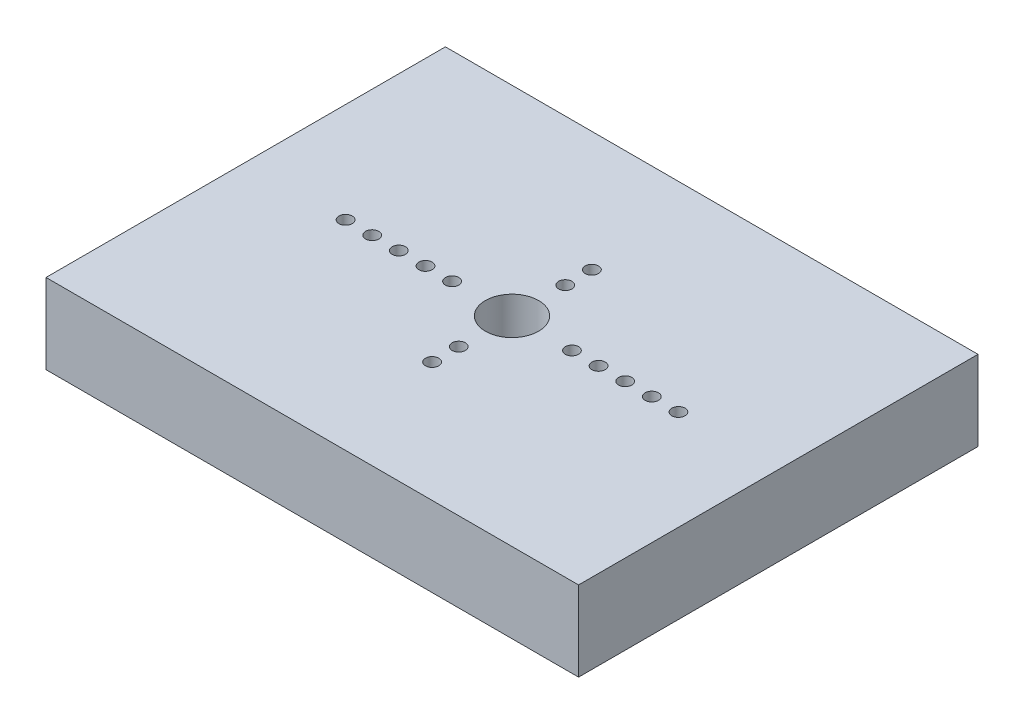
ISO-10303-21;
HEADER;
FILE_DESCRIPTION(('STEP AP214'),'2;1');
FILE_NAME('part.step','',(''),(''),'','','');
FILE_SCHEMA(('AUTOMOTIVE_DESIGN { 1 0 10303 214 1 1 1 1 }'));
ENDSEC;
DATA;
#1=APPLICATION_CONTEXT('core data for automotive mechanical design processes');
#2=APPLICATION_PROTOCOL_DEFINITION('international standard','automotive_design',2000,#1);
#3=PRODUCT_CONTEXT('',#1,'mechanical');
#4=PRODUCT('Part','Part','',(#3));
#5=PRODUCT_RELATED_PRODUCT_CATEGORY('part','',(#4));
#6=PRODUCT_DEFINITION_FORMATION('','',#4);
#7=PRODUCT_DEFINITION_CONTEXT('part definition',#1,'design');
#8=PRODUCT_DEFINITION('design','',#6,#7);
#9=PRODUCT_DEFINITION_SHAPE('','',#8);
#10=(LENGTH_UNIT() NAMED_UNIT(*) SI_UNIT(.MILLI.,.METRE.));
#11=(NAMED_UNIT(*) PLANE_ANGLE_UNIT() SI_UNIT($,.RADIAN.));
#12=(NAMED_UNIT(*) SI_UNIT($,.STERADIAN.) SOLID_ANGLE_UNIT());
#13=UNCERTAINTY_MEASURE_WITH_UNIT(LENGTH_MEASURE(1.E-05),#10,'distance_accuracy_value','');
#14=(GEOMETRIC_REPRESENTATION_CONTEXT(3) GLOBAL_UNCERTAINTY_ASSIGNED_CONTEXT((#13)) GLOBAL_UNIT_ASSIGNED_CONTEXT((#10,
#11,#12)) REPRESENTATION_CONTEXT('',''));
#15=CARTESIAN_POINT('',(0.,0.,0.));
#16=DIRECTION('',(0.,0.,1.));
#17=DIRECTION('',(1.,0.,0.));
#18=AXIS2_PLACEMENT_3D('',#15,#16,#17);
#19=CARTESIAN_POINT('',(0.,0.,0.));
#20=DIRECTION('',(0.,1.,0.));
#21=DIRECTION('',(0.,0.,1.));
#22=AXIS2_PLACEMENT_3D('',#19,#20,#21);
#23=PLANE('',#22);
#24=DIRECTION('',(0.,0.,1.));
#25=VECTOR('',#24,1.);
#26=CARTESIAN_POINT('',(-20.,0.,15.));
#27=LINE('',#26,#25);
#28=CARTESIAN_POINT('',(-20.,0.,-15.));
#29=VERTEX_POINT('',#28);
#30=CARTESIAN_POINT('',(-20.,0.,15.));
#31=VERTEX_POINT('',#30);
#32=EDGE_CURVE('E321',#29,#31,#27,.T.);
#33=ORIENTED_EDGE('',*,*,#32,.F.);
#34=DIRECTION('',(-1.,0.,0.));
#35=VECTOR('',#34,1.);
#36=CARTESIAN_POINT('',(20.,0.,-15.));
#37=LINE('',#36,#35);
#38=CARTESIAN_POINT('',(20.,0.,-15.));
#39=VERTEX_POINT('',#38);
#40=EDGE_CURVE('E63',#39,#29,#37,.T.);
#41=ORIENTED_EDGE('',*,*,#40,.F.);
#42=DIRECTION('',(0.,0.,-1.));
#43=VECTOR('',#42,1.);
#44=CARTESIAN_POINT('',(20.,0.,15.));
#45=LINE('',#44,#43);
#46=CARTESIAN_POINT('',(20.,0.,15.));
#47=VERTEX_POINT('',#46);
#48=EDGE_CURVE('E327',#47,#39,#45,.T.);
#49=ORIENTED_EDGE('',*,*,#48,.F.);
#50=DIRECTION('',(1.,0.,0.));
#51=VECTOR('',#50,1.);
#52=CARTESIAN_POINT('',(20.,0.,15.));
#53=LINE('',#52,#51);
#54=EDGE_CURVE('E324',#31,#47,#53,.T.);
#55=ORIENTED_EDGE('',*,*,#54,.F.);
#56=EDGE_LOOP('',(#33,#41,#49,#55));
#57=FACE_BOUND('',#56,.T.);
#58=DIRECTION('',(0.,0.,-1.));
#59=VECTOR('',#58,1.);
#60=CARTESIAN_POINT('',(2.55,0.,2.55));
#61=LINE('',#60,#59);
#62=CARTESIAN_POINT('',(2.55,0.,7.85));
#63=VERTEX_POINT('',#62);
#64=CARTESIAN_POINT('',(2.55,0.,2.55));
#65=VERTEX_POINT('',#64);
#66=EDGE_CURVE('E55',#63,#65,#61,.T.);
#67=ORIENTED_EDGE('',*,*,#66,.T.);
#68=DIRECTION('',(1.,0.,0.));
#69=VECTOR('',#68,1.);
#70=CARTESIAN_POINT('',(2.55,0.,2.55));
#71=LINE('',#70,#69);
#72=CARTESIAN_POINT('',(14.5,0.,2.55));
#73=VERTEX_POINT('',#72);
#74=EDGE_CURVE('E243',#65,#73,#71,.T.);
#75=ORIENTED_EDGE('',*,*,#74,.T.);
#76=DIRECTION('',(0.,0.,-1.));
#77=VECTOR('',#76,1.);
#78=CARTESIAN_POINT('',(14.5,0.,2.55));
#79=LINE('',#78,#77);
#80=CARTESIAN_POINT('',(14.5,0.,-2.55));
#81=VERTEX_POINT('',#80);
#82=EDGE_CURVE('E247',#73,#81,#79,.T.);
#83=ORIENTED_EDGE('',*,*,#82,.T.);
#84=DIRECTION('',(-1.,0.,0.));
#85=VECTOR('',#84,1.);
#86=CARTESIAN_POINT('',(2.55,0.,-2.55));
#87=LINE('',#86,#85);
#88=CARTESIAN_POINT('',(2.55,0.,-2.55));
#89=VERTEX_POINT('',#88);
#90=EDGE_CURVE('E251',#81,#89,#87,.T.);
#91=ORIENTED_EDGE('',*,*,#90,.T.);
#92=DIRECTION('',(0.,0.,-1.));
#93=VECTOR('',#92,1.);
#94=CARTESIAN_POINT('',(2.55,0.,-7.85));
#95=LINE('',#94,#93);
#96=CARTESIAN_POINT('',(2.55,0.,-7.85));
#97=VERTEX_POINT('',#96);
#98=EDGE_CURVE('E255',#89,#97,#95,.T.);
#99=ORIENTED_EDGE('',*,*,#98,.T.);
#100=DIRECTION('',(-1.,0.,0.));
#101=VECTOR('',#100,1.);
#102=CARTESIAN_POINT('',(-2.55,0.,-7.85));
#103=LINE('',#102,#101);
#104=CARTESIAN_POINT('',(-2.55,0.,-7.85));
#105=VERTEX_POINT('',#104);
#106=EDGE_CURVE('E259',#97,#105,#103,.T.);
#107=ORIENTED_EDGE('',*,*,#106,.T.);
#108=DIRECTION('',(0.,0.,1.));
#109=VECTOR('',#108,1.);
#110=CARTESIAN_POINT('',(-2.55,0.,-7.85));
#111=LINE('',#110,#109);
#112=CARTESIAN_POINT('',(-2.55,0.,-2.55));
#113=VERTEX_POINT('',#112);
#114=EDGE_CURVE('E263',#105,#113,#111,.T.);
#115=ORIENTED_EDGE('',*,*,#114,.T.);
#116=DIRECTION('',(-1.,0.,0.));
#117=VECTOR('',#116,1.);
#118=CARTESIAN_POINT('',(-14.5,0.,-2.55));
#119=LINE('',#118,#117);
#120=CARTESIAN_POINT('',(-14.5,0.,-2.55));
#121=VERTEX_POINT('',#120);
#122=EDGE_CURVE('E267',#113,#121,#119,.T.);
#123=ORIENTED_EDGE('',*,*,#122,.T.);
#124=DIRECTION('',(0.,0.,1.));
#125=VECTOR('',#124,1.);
#126=CARTESIAN_POINT('',(-14.5,0.,2.55));
#127=LINE('',#126,#125);
#128=CARTESIAN_POINT('',(-14.5,0.,2.55));
#129=VERTEX_POINT('',#128);
#130=EDGE_CURVE('E271',#121,#129,#127,.T.);
#131=ORIENTED_EDGE('',*,*,#130,.T.);
#132=DIRECTION('',(1.,0.,0.));
#133=VECTOR('',#132,1.);
#134=CARTESIAN_POINT('',(-14.5,0.,2.55));
#135=LINE('',#134,#133);
#136=CARTESIAN_POINT('',(-2.55,0.,2.55));
#137=VERTEX_POINT('',#136);
#138=EDGE_CURVE('E275',#129,#137,#135,.T.);
#139=ORIENTED_EDGE('',*,*,#138,.T.);
#140=DIRECTION('',(0.,0.,1.));
#141=VECTOR('',#140,1.);
#142=CARTESIAN_POINT('',(-2.55,0.,2.55));
#143=LINE('',#142,#141);
#144=CARTESIAN_POINT('',(-2.55,0.,7.85));
#145=VERTEX_POINT('',#144);
#146=EDGE_CURVE('E279',#137,#145,#143,.T.);
#147=ORIENTED_EDGE('',*,*,#146,.T.);
#148=DIRECTION('',(1.,0.,0.));
#149=VECTOR('',#148,1.);
#150=CARTESIAN_POINT('',(-2.55,0.,7.85));
#151=LINE('',#150,#149);
#152=EDGE_CURVE('E196',#145,#63,#151,.T.);
#153=ORIENTED_EDGE('',*,*,#152,.T.);
#154=EDGE_LOOP('',(#67,#75,#83,#91,#99,#107,#115,#123,#131,#139,#147,#153));
#155=FACE_BOUND('',#154,.T.);
#156=ADVANCED_FACE('F39',(#57,#155),#23,.F.);
#157=CARTESIAN_POINT('',(-20.,3.,15.));
#158=DIRECTION('',(1.,0.,0.));
#159=DIRECTION('',(0.,0.,-1.));
#160=AXIS2_PLACEMENT_3D('',#157,#158,#159);
#161=PLANE('',#160);
#162=ORIENTED_EDGE('',*,*,#32,.T.);
#163=DIRECTION('',(0.,-1.,0.));
#164=VECTOR('',#163,1.);
#165=CARTESIAN_POINT('',(-20.,3.,15.));
#166=LINE('',#165,#164);
#167=CARTESIAN_POINT('',(-20.,6.,15.));
#168=VERTEX_POINT('',#167);
#169=EDGE_CURVE('E11',#168,#31,#166,.T.);
#170=ORIENTED_EDGE('',*,*,#169,.F.);
#171=DIRECTION('',(0.,0.,1.));
#172=VECTOR('',#171,1.);
#173=CARTESIAN_POINT('',(-20.,6.,-15.));
#174=LINE('',#173,#172);
#175=CARTESIAN_POINT('',(-20.,6.,-15.));
#176=VERTEX_POINT('',#175);
#177=EDGE_CURVE('E166',#176,#168,#174,.T.);
#178=ORIENTED_EDGE('',*,*,#177,.F.);
#179=DIRECTION('',(0.,-1.,0.));
#180=VECTOR('',#179,1.);
#181=CARTESIAN_POINT('',(-20.,3.,-15.));
#182=LINE('',#181,#180);
#183=EDGE_CURVE('E154',#176,#29,#182,.T.);
#184=ORIENTED_EDGE('',*,*,#183,.T.);
#185=EDGE_LOOP('',(#162,#170,#178,#184));
#186=FACE_BOUND('',#185,.T.);
#187=ADVANCED_FACE('F41',(#186),#161,.F.);
#188=CARTESIAN_POINT('',(20.,3.,15.));
#189=DIRECTION('',(0.,0.,-1.));
#190=DIRECTION('',(-1.,0.,0.));
#191=AXIS2_PLACEMENT_3D('',#188,#189,#190);
#192=PLANE('',#191);
#193=ORIENTED_EDGE('',*,*,#54,.T.);
#194=DIRECTION('',(0.,-1.,0.));
#195=VECTOR('',#194,1.);
#196=CARTESIAN_POINT('',(20.,3.,15.));
#197=LINE('',#196,#195);
#198=CARTESIAN_POINT('',(20.,6.,15.));
#199=VERTEX_POINT('',#198);
#200=EDGE_CURVE('E48',#199,#47,#197,.T.);
#201=ORIENTED_EDGE('',*,*,#200,.F.);
#202=DIRECTION('',(1.,0.,0.));
#203=VECTOR('',#202,1.);
#204=CARTESIAN_POINT('',(-20.,6.,15.));
#205=LINE('',#204,#203);
#206=EDGE_CURVE('E171',#168,#199,#205,.T.);
#207=ORIENTED_EDGE('',*,*,#206,.F.);
#208=ORIENTED_EDGE('',*,*,#169,.T.);
#209=EDGE_LOOP('',(#193,#201,#207,#208));
#210=FACE_BOUND('',#209,.T.);
#211=ADVANCED_FACE('F341',(#210),#192,.F.);
#212=CARTESIAN_POINT('',(20.,3.,15.));
#213=DIRECTION('',(-1.,0.,0.));
#214=DIRECTION('',(0.,0.,1.));
#215=AXIS2_PLACEMENT_3D('',#212,#213,#214);
#216=PLANE('',#215);
#217=ORIENTED_EDGE('',*,*,#48,.T.);
#218=DIRECTION('',(0.,-1.,0.));
#219=VECTOR('',#218,1.);
#220=CARTESIAN_POINT('',(20.,3.,-15.));
#221=LINE('',#220,#219);
#222=CARTESIAN_POINT('',(20.,6.,-15.));
#223=VERTEX_POINT('',#222);
#224=EDGE_CURVE('E163',#223,#39,#221,.T.);
#225=ORIENTED_EDGE('',*,*,#224,.F.);
#226=DIRECTION('',(0.,0.,-1.));
#227=VECTOR('',#226,1.);
#228=CARTESIAN_POINT('',(20.,6.,15.));
#229=LINE('',#228,#227);
#230=EDGE_CURVE('E177',#199,#223,#229,.T.);
#231=ORIENTED_EDGE('',*,*,#230,.F.);
#232=ORIENTED_EDGE('',*,*,#200,.T.);
#233=EDGE_LOOP('',(#217,#225,#231,#232));
#234=FACE_BOUND('',#233,.T.);
#235=ADVANCED_FACE('F337',(#234),#216,.F.);
#236=CARTESIAN_POINT('',(20.,3.,-15.));
#237=DIRECTION('',(0.,0.,1.));
#238=DIRECTION('',(1.,0.,0.));
#239=AXIS2_PLACEMENT_3D('',#236,#237,#238);
#240=PLANE('',#239);
#241=ORIENTED_EDGE('',*,*,#40,.T.);
#242=ORIENTED_EDGE('',*,*,#183,.F.);
#243=DIRECTION('',(-1.,0.,0.));
#244=VECTOR('',#243,1.);
#245=CARTESIAN_POINT('',(20.,6.,-15.));
#246=LINE('',#245,#244);
#247=EDGE_CURVE('E158',#223,#176,#246,.T.);
#248=ORIENTED_EDGE('',*,*,#247,.F.);
#249=ORIENTED_EDGE('',*,*,#224,.T.);
#250=EDGE_LOOP('',(#241,#242,#248,#249));
#251=FACE_BOUND('',#250,.T.);
#252=ADVANCED_FACE('F156',(#251),#240,.F.);
#253=CARTESIAN_POINT('',(2.55,3.,2.55));
#254=DIRECTION('',(-1.,0.,0.));
#255=DIRECTION('',(0.,0.,1.));
#256=AXIS2_PLACEMENT_3D('',#253,#254,#255);
#257=PLANE('',#256);
#258=ORIENTED_EDGE('',*,*,#66,.F.);
#259=DIRECTION('',(0.,-1.,0.));
#260=VECTOR('',#259,1.);
#261=CARTESIAN_POINT('',(2.55,3.,7.85));
#262=LINE('',#261,#260);
#263=CARTESIAN_POINT('',(2.55,3.,7.85));
#264=VERTEX_POINT('',#263);
#265=EDGE_CURVE('E240',#264,#63,#262,.T.);
#266=ORIENTED_EDGE('',*,*,#265,.F.);
#267=DIRECTION('',(0.,0.,-1.));
#268=VECTOR('',#267,1.);
#269=CARTESIAN_POINT('',(2.55,3.,2.55));
#270=LINE('',#269,#268);
#271=CARTESIAN_POINT('',(2.55,3.,2.55));
#272=VERTEX_POINT('',#271);
#273=EDGE_CURVE('E191',#264,#272,#270,.T.);
#274=ORIENTED_EDGE('',*,*,#273,.T.);
#275=DIRECTION('',(0.,-1.,0.));
#276=VECTOR('',#275,1.);
#277=CARTESIAN_POINT('',(2.55,3.,2.55));
#278=LINE('',#277,#276);
#279=EDGE_CURVE('E318',#272,#65,#278,.T.);
#280=ORIENTED_EDGE('',*,*,#279,.T.);
#281=EDGE_LOOP('',(#258,#266,#274,#280));
#282=FACE_BOUND('',#281,.T.);
#283=ADVANCED_FACE('F354',(#282),#257,.T.);
#284=CARTESIAN_POINT('',(2.55,3.,2.55));
#285=DIRECTION('',(0.,0.,-1.));
#286=DIRECTION('',(-1.,0.,0.));
#287=AXIS2_PLACEMENT_3D('',#284,#285,#286);
#288=PLANE('',#287);
#289=ORIENTED_EDGE('',*,*,#74,.F.);
#290=ORIENTED_EDGE('',*,*,#279,.F.);
#291=DIRECTION('',(1.,0.,0.));
#292=VECTOR('',#291,1.);
#293=CARTESIAN_POINT('',(2.55,3.,2.55));
#294=LINE('',#293,#292);
#295=CARTESIAN_POINT('',(14.5,3.,2.55));
#296=VERTEX_POINT('',#295);
#297=EDGE_CURVE('E195',#272,#296,#294,.T.);
#298=ORIENTED_EDGE('',*,*,#297,.T.);
#299=DIRECTION('',(0.,-1.,0.));
#300=VECTOR('',#299,1.);
#301=CARTESIAN_POINT('',(14.5,3.,2.55));
#302=LINE('',#301,#300);
#303=EDGE_CURVE('E315',#296,#73,#302,.T.);
#304=ORIENTED_EDGE('',*,*,#303,.T.);
#305=EDGE_LOOP('',(#289,#290,#298,#304));
#306=FACE_BOUND('',#305,.T.);
#307=ADVANCED_FACE('F360',(#306),#288,.T.);
#308=CARTESIAN_POINT('',(14.5,3.,2.55));
#309=DIRECTION('',(-1.,0.,0.));
#310=DIRECTION('',(0.,0.,1.));
#311=AXIS2_PLACEMENT_3D('',#308,#309,#310);
#312=PLANE('',#311);
#313=ORIENTED_EDGE('',*,*,#82,.F.);
#314=ORIENTED_EDGE('',*,*,#303,.F.);
#315=DIRECTION('',(0.,0.,-1.));
#316=VECTOR('',#315,1.);
#317=CARTESIAN_POINT('',(14.5,3.,2.55));
#318=LINE('',#317,#316);
#319=CARTESIAN_POINT('',(14.5,3.,-2.55));
#320=VERTEX_POINT('',#319);
#321=EDGE_CURVE('E200',#296,#320,#318,.T.);
#322=ORIENTED_EDGE('',*,*,#321,.T.);
#323=DIRECTION('',(0.,-1.,0.));
#324=VECTOR('',#323,1.);
#325=CARTESIAN_POINT('',(14.5,3.,-2.55));
#326=LINE('',#325,#324);
#327=EDGE_CURVE('E312',#320,#81,#326,.T.);
#328=ORIENTED_EDGE('',*,*,#327,.T.);
#329=EDGE_LOOP('',(#313,#314,#322,#328));
#330=FACE_BOUND('',#329,.T.);
#331=ADVANCED_FACE('F364',(#330),#312,.T.);
#332=CARTESIAN_POINT('',(2.55,3.,-2.55));
#333=DIRECTION('',(0.,0.,1.));
#334=DIRECTION('',(1.,0.,0.));
#335=AXIS2_PLACEMENT_3D('',#332,#333,#334);
#336=PLANE('',#335);
#337=ORIENTED_EDGE('',*,*,#90,.F.);
#338=ORIENTED_EDGE('',*,*,#327,.F.);
#339=DIRECTION('',(-1.,0.,0.));
#340=VECTOR('',#339,1.);
#341=CARTESIAN_POINT('',(2.55,3.,-2.55));
#342=LINE('',#341,#340);
#343=CARTESIAN_POINT('',(2.55,3.,-2.55));
#344=VERTEX_POINT('',#343);
#345=EDGE_CURVE('E204',#320,#344,#342,.T.);
#346=ORIENTED_EDGE('',*,*,#345,.T.);
#347=DIRECTION('',(0.,-1.,0.));
#348=VECTOR('',#347,1.);
#349=CARTESIAN_POINT('',(2.55,3.,-2.55));
#350=LINE('',#349,#348);
#351=EDGE_CURVE('E309',#344,#89,#350,.T.);
#352=ORIENTED_EDGE('',*,*,#351,.T.);
#353=EDGE_LOOP('',(#337,#338,#346,#352));
#354=FACE_BOUND('',#353,.T.);
#355=ADVANCED_FACE('F369',(#354),#336,.T.);
#356=CARTESIAN_POINT('',(2.55,3.,-7.85));
#357=DIRECTION('',(-1.,0.,0.));
#358=DIRECTION('',(0.,0.,1.));
#359=AXIS2_PLACEMENT_3D('',#356,#357,#358);
#360=PLANE('',#359);
#361=ORIENTED_EDGE('',*,*,#98,.F.);
#362=ORIENTED_EDGE('',*,*,#351,.F.);
#363=DIRECTION('',(0.,0.,-1.));
#364=VECTOR('',#363,1.);
#365=CARTESIAN_POINT('',(2.55,3.,-7.85));
#366=LINE('',#365,#364);
#367=CARTESIAN_POINT('',(2.55,3.,-7.85));
#368=VERTEX_POINT('',#367);
#369=EDGE_CURVE('E208',#344,#368,#366,.T.);
#370=ORIENTED_EDGE('',*,*,#369,.T.);
#371=DIRECTION('',(0.,-1.,0.));
#372=VECTOR('',#371,1.);
#373=CARTESIAN_POINT('',(2.55,3.,-7.85));
#374=LINE('',#373,#372);
#375=EDGE_CURVE('E306',#368,#97,#374,.T.);
#376=ORIENTED_EDGE('',*,*,#375,.T.);
#377=EDGE_LOOP('',(#361,#362,#370,#376));
#378=FACE_BOUND('',#377,.T.);
#379=ADVANCED_FACE('F375',(#378),#360,.T.);
#380=CARTESIAN_POINT('',(-2.55,3.,-7.85));
#381=DIRECTION('',(0.,0.,1.));
#382=DIRECTION('',(1.,0.,0.));
#383=AXIS2_PLACEMENT_3D('',#380,#381,#382);
#384=PLANE('',#383);
#385=ORIENTED_EDGE('',*,*,#106,.F.);
#386=ORIENTED_EDGE('',*,*,#375,.F.);
#387=DIRECTION('',(-1.,0.,0.));
#388=VECTOR('',#387,1.);
#389=CARTESIAN_POINT('',(-2.55,3.,-7.85));
#390=LINE('',#389,#388);
#391=CARTESIAN_POINT('',(-2.55,3.,-7.85));
#392=VERTEX_POINT('',#391);
#393=EDGE_CURVE('E212',#368,#392,#390,.T.);
#394=ORIENTED_EDGE('',*,*,#393,.T.);
#395=DIRECTION('',(0.,-1.,0.));
#396=VECTOR('',#395,1.);
#397=CARTESIAN_POINT('',(-2.55,3.,-7.85));
#398=LINE('',#397,#396);
#399=EDGE_CURVE('E303',#392,#105,#398,.T.);
#400=ORIENTED_EDGE('',*,*,#399,.T.);
#401=EDGE_LOOP('',(#385,#386,#394,#400));
#402=FACE_BOUND('',#401,.T.);
#403=ADVANCED_FACE('F379',(#402),#384,.T.);
#404=CARTESIAN_POINT('',(-2.55,3.,-7.85));
#405=DIRECTION('',(1.,0.,0.));
#406=DIRECTION('',(0.,0.,-1.));
#407=AXIS2_PLACEMENT_3D('',#404,#405,#406);
#408=PLANE('',#407);
#409=ORIENTED_EDGE('',*,*,#114,.F.);
#410=ORIENTED_EDGE('',*,*,#399,.F.);
#411=DIRECTION('',(0.,0.,1.));
#412=VECTOR('',#411,1.);
#413=CARTESIAN_POINT('',(-2.55,3.,-7.85));
#414=LINE('',#413,#412);
#415=CARTESIAN_POINT('',(-2.55,3.,-2.55));
#416=VERTEX_POINT('',#415);
#417=EDGE_CURVE('E216',#392,#416,#414,.T.);
#418=ORIENTED_EDGE('',*,*,#417,.T.);
#419=DIRECTION('',(0.,-1.,0.));
#420=VECTOR('',#419,1.);
#421=CARTESIAN_POINT('',(-2.55,3.,-2.55));
#422=LINE('',#421,#420);
#423=EDGE_CURVE('E300',#416,#113,#422,.T.);
#424=ORIENTED_EDGE('',*,*,#423,.T.);
#425=EDGE_LOOP('',(#409,#410,#418,#424));
#426=FACE_BOUND('',#425,.T.);
#427=ADVANCED_FACE('F383',(#426),#408,.T.);
#428=CARTESIAN_POINT('',(-14.5,3.,-2.55));
#429=DIRECTION('',(0.,0.,1.));
#430=DIRECTION('',(1.,0.,0.));
#431=AXIS2_PLACEMENT_3D('',#428,#429,#430);
#432=PLANE('',#431);
#433=ORIENTED_EDGE('',*,*,#122,.F.);
#434=ORIENTED_EDGE('',*,*,#423,.F.);
#435=DIRECTION('',(-1.,0.,0.));
#436=VECTOR('',#435,1.);
#437=CARTESIAN_POINT('',(-14.5,3.,-2.55));
#438=LINE('',#437,#436);
#439=CARTESIAN_POINT('',(-14.5,3.,-2.55));
#440=VERTEX_POINT('',#439);
#441=EDGE_CURVE('E220',#416,#440,#438,.T.);
#442=ORIENTED_EDGE('',*,*,#441,.T.);
#443=DIRECTION('',(0.,-1.,0.));
#444=VECTOR('',#443,1.);
#445=CARTESIAN_POINT('',(-14.5,3.,-2.55));
#446=LINE('',#445,#444);
#447=EDGE_CURVE('E297',#440,#121,#446,.T.);
#448=ORIENTED_EDGE('',*,*,#447,.T.);
#449=EDGE_LOOP('',(#433,#434,#442,#448));
#450=FACE_BOUND('',#449,.T.);
#451=ADVANCED_FACE('F387',(#450),#432,.T.);
#452=CARTESIAN_POINT('',(-14.5,3.,2.55));
#453=DIRECTION('',(1.,0.,0.));
#454=DIRECTION('',(0.,0.,-1.));
#455=AXIS2_PLACEMENT_3D('',#452,#453,#454);
#456=PLANE('',#455);
#457=ORIENTED_EDGE('',*,*,#130,.F.);
#458=ORIENTED_EDGE('',*,*,#447,.F.);
#459=DIRECTION('',(0.,0.,1.));
#460=VECTOR('',#459,1.);
#461=CARTESIAN_POINT('',(-14.5,3.,2.55));
#462=LINE('',#461,#460);
#463=CARTESIAN_POINT('',(-14.5,3.,2.55));
#464=VERTEX_POINT('',#463);
#465=EDGE_CURVE('E224',#440,#464,#462,.T.);
#466=ORIENTED_EDGE('',*,*,#465,.T.);
#467=DIRECTION('',(0.,-1.,0.));
#468=VECTOR('',#467,1.);
#469=CARTESIAN_POINT('',(-14.5,3.,2.55));
#470=LINE('',#469,#468);
#471=EDGE_CURVE('E294',#464,#129,#470,.T.);
#472=ORIENTED_EDGE('',*,*,#471,.T.);
#473=EDGE_LOOP('',(#457,#458,#466,#472));
#474=FACE_BOUND('',#473,.T.);
#475=ADVANCED_FACE('F391',(#474),#456,.T.);
#476=CARTESIAN_POINT('',(-14.5,3.,2.55));
#477=DIRECTION('',(0.,0.,-1.));
#478=DIRECTION('',(-1.,0.,0.));
#479=AXIS2_PLACEMENT_3D('',#476,#477,#478);
#480=PLANE('',#479);
#481=ORIENTED_EDGE('',*,*,#138,.F.);
#482=ORIENTED_EDGE('',*,*,#471,.F.);
#483=DIRECTION('',(1.,0.,0.));
#484=VECTOR('',#483,1.);
#485=CARTESIAN_POINT('',(-14.5,3.,2.55));
#486=LINE('',#485,#484);
#487=CARTESIAN_POINT('',(-2.55,3.,2.55));
#488=VERTEX_POINT('',#487);
#489=EDGE_CURVE('E228',#464,#488,#486,.T.);
#490=ORIENTED_EDGE('',*,*,#489,.T.);
#491=DIRECTION('',(0.,-1.,0.));
#492=VECTOR('',#491,1.);
#493=CARTESIAN_POINT('',(-2.55,3.,2.55));
#494=LINE('',#493,#492);
#495=EDGE_CURVE('E291',#488,#137,#494,.T.);
#496=ORIENTED_EDGE('',*,*,#495,.T.);
#497=EDGE_LOOP('',(#481,#482,#490,#496));
#498=FACE_BOUND('',#497,.T.);
#499=ADVANCED_FACE('F395',(#498),#480,.T.);
#500=CARTESIAN_POINT('',(-2.55,3.,2.55));
#501=DIRECTION('',(1.,0.,0.));
#502=DIRECTION('',(0.,0.,-1.));
#503=AXIS2_PLACEMENT_3D('',#500,#501,#502);
#504=PLANE('',#503);
#505=ORIENTED_EDGE('',*,*,#146,.F.);
#506=ORIENTED_EDGE('',*,*,#495,.F.);
#507=DIRECTION('',(0.,0.,1.));
#508=VECTOR('',#507,1.);
#509=CARTESIAN_POINT('',(-2.55,3.,2.55));
#510=LINE('',#509,#508);
#511=CARTESIAN_POINT('',(-2.55,3.,7.85));
#512=VERTEX_POINT('',#511);
#513=EDGE_CURVE('E232',#488,#512,#510,.T.);
#514=ORIENTED_EDGE('',*,*,#513,.T.);
#515=DIRECTION('',(0.,-1.,0.));
#516=VECTOR('',#515,1.);
#517=CARTESIAN_POINT('',(-2.55,3.,7.85));
#518=LINE('',#517,#516);
#519=EDGE_CURVE('E288',#512,#145,#518,.T.);
#520=ORIENTED_EDGE('',*,*,#519,.T.);
#521=EDGE_LOOP('',(#505,#506,#514,#520));
#522=FACE_BOUND('',#521,.T.);
#523=ADVANCED_FACE('F399',(#522),#504,.T.);
#524=CARTESIAN_POINT('',(-2.55,3.,7.85));
#525=DIRECTION('',(0.,0.,-1.));
#526=DIRECTION('',(-1.,0.,0.));
#527=AXIS2_PLACEMENT_3D('',#524,#525,#526);
#528=PLANE('',#527);
#529=ORIENTED_EDGE('',*,*,#152,.F.);
#530=ORIENTED_EDGE('',*,*,#519,.F.);
#531=DIRECTION('',(1.,0.,0.));
#532=VECTOR('',#531,1.);
#533=CARTESIAN_POINT('',(-2.55,3.,7.85));
#534=LINE('',#533,#532);
#535=EDGE_CURVE('E236',#512,#264,#534,.T.);
#536=ORIENTED_EDGE('',*,*,#535,.T.);
#537=ORIENTED_EDGE('',*,*,#265,.T.);
#538=EDGE_LOOP('',(#529,#530,#536,#537));
#539=FACE_BOUND('',#538,.T.);
#540=ADVANCED_FACE('F403',(#539),#528,.T.);
#541=CARTESIAN_POINT('',(0.,6.,0.));
#542=DIRECTION('',(0.,1.,0.));
#543=DIRECTION('',(0.,0.,1.));
#544=AXIS2_PLACEMENT_3D('',#541,#542,#543);
#545=PLANE('',#544);
#546=CARTESIAN_POINT('',(0.,6.,3.99999999999999));
#547=DIRECTION('',(0.,1.,0.));
#548=DIRECTION('',(0.,0.,-1.));
#549=AXIS2_PLACEMENT_3D('',#546,#547,#548);
#550=CIRCLE('',#549,0.5);
#551=CARTESIAN_POINT('',(0.,6.,3.49999999999999));
#552=VERTEX_POINT('',#551);
#553=EDGE_CURVE('E490',#552,#552,#550,.T.);
#554=ORIENTED_EDGE('',*,*,#553,.F.);
#555=EDGE_LOOP('',(#554));
#556=FACE_BOUND('',#555,.T.);
#557=CARTESIAN_POINT('',(6.5,6.,0.));
#558=DIRECTION('',(0.,1.,0.));
#559=DIRECTION('',(0.,0.,-1.));
#560=AXIS2_PLACEMENT_3D('',#557,#558,#559);
#561=CIRCLE('',#560,0.499999999999998);
#562=CARTESIAN_POINT('',(6.5,6.,-0.499999999999987));
#563=VERTEX_POINT('',#562);
#564=EDGE_CURVE('E506',#563,#563,#561,.T.);
#565=ORIENTED_EDGE('',*,*,#564,.F.);
#566=EDGE_LOOP('',(#565));
#567=FACE_BOUND('',#566,.T.);
#568=CARTESIAN_POINT('',(10.5,6.,0.));
#569=DIRECTION('',(0.,1.,0.));
#570=DIRECTION('',(0.,0.,-1.));
#571=AXIS2_PLACEMENT_3D('',#568,#569,#570);
#572=CIRCLE('',#571,0.499999999999999);
#573=CARTESIAN_POINT('',(10.5,6.,-0.499999999999961));
#574=VERTEX_POINT('',#573);
#575=EDGE_CURVE('E522',#574,#574,#572,.T.);
#576=ORIENTED_EDGE('',*,*,#575,.F.);
#577=EDGE_LOOP('',(#576));
#578=FACE_BOUND('',#577,.T.);
#579=CARTESIAN_POINT('',(0.,6.,-6.));
#580=DIRECTION('',(0.,1.,0.));
#581=DIRECTION('',(0.,0.,1.));
#582=AXIS2_PLACEMENT_3D('',#579,#580,#581);
#583=CIRCLE('',#582,0.5);
#584=CARTESIAN_POINT('',(0.,6.,-5.5));
#585=VERTEX_POINT('',#584);
#586=EDGE_CURVE('E538',#585,#585,#583,.T.);
#587=ORIENTED_EDGE('',*,*,#586,.F.);
#588=EDGE_LOOP('',(#587));
#589=FACE_BOUND('',#588,.T.);
#590=CARTESIAN_POINT('',(-12.5,6.,0.));
#591=DIRECTION('',(0.,1.,0.));
#592=DIRECTION('',(0.,0.,1.));
#593=AXIS2_PLACEMENT_3D('',#590,#591,#592);
#594=CIRCLE('',#593,0.500000000000001);
#595=CARTESIAN_POINT('',(-12.5,6.,0.500000000000057));
#596=VERTEX_POINT('',#595);
#597=EDGE_CURVE('E554',#596,#596,#594,.T.);
#598=ORIENTED_EDGE('',*,*,#597,.F.);
#599=EDGE_LOOP('',(#598));
#600=FACE_BOUND('',#599,.T.);
#601=CARTESIAN_POINT('',(-8.5,6.,0.));
#602=DIRECTION('',(0.,1.,0.));
#603=DIRECTION('',(0.,0.,1.));
#604=AXIS2_PLACEMENT_3D('',#601,#602,#603);
#605=CIRCLE('',#604,0.500000000000001);
#606=CARTESIAN_POINT('',(-8.5,6.,0.500000000000029));
#607=VERTEX_POINT('',#606);
#608=EDGE_CURVE('E570',#607,#607,#605,.T.);
#609=ORIENTED_EDGE('',*,*,#608,.F.);
#610=EDGE_LOOP('',(#609));
#611=FACE_BOUND('',#610,.T.);
#612=CARTESIAN_POINT('',(-4.5,6.,0.));
#613=DIRECTION('',(0.,1.,0.));
#614=DIRECTION('',(0.,0.,1.));
#615=AXIS2_PLACEMENT_3D('',#612,#613,#614);
#616=CIRCLE('',#615,0.5);
#617=CARTESIAN_POINT('',(-4.5,6.,0.5));
#618=VERTEX_POINT('',#617);
#619=EDGE_CURVE('E586',#618,#618,#616,.T.);
#620=ORIENTED_EDGE('',*,*,#619,.F.);
#621=EDGE_LOOP('',(#620));
#622=FACE_BOUND('',#621,.T.);
#623=ORIENTED_EDGE('',*,*,#247,.T.);
#624=ORIENTED_EDGE('',*,*,#177,.T.);
#625=ORIENTED_EDGE('',*,*,#206,.T.);
#626=ORIENTED_EDGE('',*,*,#230,.T.);
#627=EDGE_LOOP('',(#623,#624,#625,#626));
#628=FACE_BOUND('',#627,.T.);
#629=CARTESIAN_POINT('',(0.,6.,0.));
#630=DIRECTION('',(0.,1.,0.));
#631=DIRECTION('',(0.,0.,1.));
#632=AXIS2_PLACEMENT_3D('',#629,#630,#631);
#633=CIRCLE('',#632,2.);
#634=CARTESIAN_POINT('',(0.,6.,2.));
#635=VERTEX_POINT('',#634);
#636=EDGE_CURVE('E179',#635,#635,#633,.T.);
#637=ORIENTED_EDGE('',*,*,#636,.F.);
#638=EDGE_LOOP('',(#637));
#639=FACE_BOUND('',#638,.T.);
#640=CARTESIAN_POINT('',(-6.5,6.,0.));
#641=DIRECTION('',(0.,1.,0.));
#642=DIRECTION('',(0.,0.,1.));
#643=AXIS2_PLACEMENT_3D('',#640,#641,#642);
#644=CIRCLE('',#643,0.5);
#645=CARTESIAN_POINT('',(-6.5,6.,0.500000000000014));
#646=VERTEX_POINT('',#645);
#647=EDGE_CURVE('E578',#646,#646,#644,.T.);
#648=ORIENTED_EDGE('',*,*,#647,.F.);
#649=EDGE_LOOP('',(#648));
#650=FACE_BOUND('',#649,.T.);
#651=CARTESIAN_POINT('',(-10.5,6.,0.));
#652=DIRECTION('',(0.,1.,0.));
#653=DIRECTION('',(0.,0.,1.));
#654=AXIS2_PLACEMENT_3D('',#651,#652,#653);
#655=CIRCLE('',#654,0.499999999999999);
#656=CARTESIAN_POINT('',(-10.5,6.,0.500000000000041));
#657=VERTEX_POINT('',#656);
#658=EDGE_CURVE('E562',#657,#657,#655,.T.);
#659=ORIENTED_EDGE('',*,*,#658,.F.);
#660=EDGE_LOOP('',(#659));
#661=FACE_BOUND('',#660,.T.);
#662=CARTESIAN_POINT('',(0.,6.,-4.));
#663=DIRECTION('',(0.,1.,0.));
#664=DIRECTION('',(0.,0.,1.));
#665=AXIS2_PLACEMENT_3D('',#662,#663,#664);
#666=CIRCLE('',#665,0.5);
#667=CARTESIAN_POINT('',(0.,6.,-3.5));
#668=VERTEX_POINT('',#667);
#669=EDGE_CURVE('E546',#668,#668,#666,.T.);
#670=ORIENTED_EDGE('',*,*,#669,.F.);
#671=EDGE_LOOP('',(#670));
#672=FACE_BOUND('',#671,.T.);
#673=CARTESIAN_POINT('',(12.5,6.,0.));
#674=DIRECTION('',(0.,1.,0.));
#675=DIRECTION('',(0.,0.,-1.));
#676=AXIS2_PLACEMENT_3D('',#673,#674,#675);
#677=CIRCLE('',#676,0.500000000000001);
#678=CARTESIAN_POINT('',(12.5,6.,-0.499999999999948));
#679=VERTEX_POINT('',#678);
#680=EDGE_CURVE('E530',#679,#679,#677,.T.);
#681=ORIENTED_EDGE('',*,*,#680,.F.);
#682=EDGE_LOOP('',(#681));
#683=FACE_BOUND('',#682,.T.);
#684=CARTESIAN_POINT('',(8.5,6.,0.));
#685=DIRECTION('',(0.,1.,0.));
#686=DIRECTION('',(0.,0.,-1.));
#687=AXIS2_PLACEMENT_3D('',#684,#685,#686);
#688=CIRCLE('',#687,0.5);
#689=CARTESIAN_POINT('',(8.5,6.,-0.499999999999976));
#690=VERTEX_POINT('',#689);
#691=EDGE_CURVE('E514',#690,#690,#688,.T.);
#692=ORIENTED_EDGE('',*,*,#691,.F.);
#693=EDGE_LOOP('',(#692));
#694=FACE_BOUND('',#693,.T.);
#695=CARTESIAN_POINT('',(4.5,6.,0.));
#696=DIRECTION('',(0.,1.,0.));
#697=DIRECTION('',(0.,0.,-1.));
#698=AXIS2_PLACEMENT_3D('',#695,#696,#697);
#699=CIRCLE('',#698,0.499999999999999);
#700=CARTESIAN_POINT('',(4.5,6.,-0.499999999999999));
#701=VERTEX_POINT('',#700);
#702=EDGE_CURVE('E498',#701,#701,#699,.T.);
#703=ORIENTED_EDGE('',*,*,#702,.F.);
#704=EDGE_LOOP('',(#703));
#705=FACE_BOUND('',#704,.T.);
#706=CARTESIAN_POINT('',(0.,6.,5.99999999999999));
#707=DIRECTION('',(0.,1.,0.));
#708=DIRECTION('',(0.,0.,-1.));
#709=AXIS2_PLACEMENT_3D('',#706,#707,#708);
#710=CIRCLE('',#709,0.5);
#711=CARTESIAN_POINT('',(0.,6.,5.49999999999999));
#712=VERTEX_POINT('',#711);
#713=EDGE_CURVE('E479',#712,#712,#710,.T.);
#714=ORIENTED_EDGE('',*,*,#713,.F.);
#715=EDGE_LOOP('',(#714));
#716=FACE_BOUND('',#715,.T.);
#717=ADVANCED_FACE('F174',(#556,#567,#578,#589,#600,#611,#622,#628,#639,#650,#661,#672,#683,
#694,#705,#716),#545,.T.);
#718=CARTESIAN_POINT('',(0.,3.,0.));
#719=DIRECTION('',(0.,1.,0.));
#720=DIRECTION('',(0.,0.,1.));
#721=AXIS2_PLACEMENT_3D('',#718,#719,#720);
#722=PLANE('',#721);
#723=ORIENTED_EDGE('',*,*,#297,.F.);
#724=ORIENTED_EDGE('',*,*,#273,.F.);
#725=ORIENTED_EDGE('',*,*,#535,.F.);
#726=ORIENTED_EDGE('',*,*,#513,.F.);
#727=ORIENTED_EDGE('',*,*,#489,.F.);
#728=ORIENTED_EDGE('',*,*,#465,.F.);
#729=ORIENTED_EDGE('',*,*,#441,.F.);
#730=ORIENTED_EDGE('',*,*,#417,.F.);
#731=ORIENTED_EDGE('',*,*,#393,.F.);
#732=ORIENTED_EDGE('',*,*,#369,.F.);
#733=ORIENTED_EDGE('',*,*,#345,.F.);
#734=ORIENTED_EDGE('',*,*,#321,.F.);
#735=EDGE_LOOP('',(#723,#724,#725,#726,#727,#728,#729,#730,#731,#732,#733,#734));
#736=FACE_BOUND('',#735,.T.);
#737=CARTESIAN_POINT('',(0.,3.,0.));
#738=DIRECTION('',(0.,1.,0.));
#739=DIRECTION('',(0.,0.,1.));
#740=AXIS2_PLACEMENT_3D('',#737,#738,#739);
#741=CIRCLE('',#740,2.);
#742=CARTESIAN_POINT('',(0.,3.,2.));
#743=VERTEX_POINT('',#742);
#744=EDGE_CURVE('E183',#743,#743,#741,.T.);
#745=ORIENTED_EDGE('',*,*,#744,.T.);
#746=EDGE_LOOP('',(#745));
#747=FACE_BOUND('',#746,.T.);
#748=CARTESIAN_POINT('',(-4.5,3.,0.));
#749=DIRECTION('',(0.,1.,0.));
#750=DIRECTION('',(0.,0.,1.));
#751=AXIS2_PLACEMENT_3D('',#748,#749,#750);
#752=CIRCLE('',#751,0.5);
#753=CARTESIAN_POINT('',(-4.5,3.,0.5));
#754=VERTEX_POINT('',#753);
#755=EDGE_CURVE('E582',#754,#754,#752,.T.);
#756=ORIENTED_EDGE('',*,*,#755,.T.);
#757=EDGE_LOOP('',(#756));
#758=FACE_BOUND('',#757,.T.);
#759=CARTESIAN_POINT('',(-6.5,3.,0.));
#760=DIRECTION('',(0.,1.,0.));
#761=DIRECTION('',(0.,0.,1.));
#762=AXIS2_PLACEMENT_3D('',#759,#760,#761);
#763=CIRCLE('',#762,0.5);
#764=CARTESIAN_POINT('',(-6.5,3.,0.500000000000014));
#765=VERTEX_POINT('',#764);
#766=EDGE_CURVE('E574',#765,#765,#763,.T.);
#767=ORIENTED_EDGE('',*,*,#766,.T.);
#768=EDGE_LOOP('',(#767));
#769=FACE_BOUND('',#768,.T.);
#770=CARTESIAN_POINT('',(-8.5,3.,0.));
#771=DIRECTION('',(0.,1.,0.));
#772=DIRECTION('',(0.,0.,1.));
#773=AXIS2_PLACEMENT_3D('',#770,#771,#772);
#774=CIRCLE('',#773,0.500000000000001);
#775=CARTESIAN_POINT('',(-8.5,3.,0.500000000000029));
#776=VERTEX_POINT('',#775);
#777=EDGE_CURVE('E566',#776,#776,#774,.T.);
#778=ORIENTED_EDGE('',*,*,#777,.T.);
#779=EDGE_LOOP('',(#778));
#780=FACE_BOUND('',#779,.T.);
#781=CARTESIAN_POINT('',(-10.5,3.,0.));
#782=DIRECTION('',(0.,1.,0.));
#783=DIRECTION('',(0.,0.,1.));
#784=AXIS2_PLACEMENT_3D('',#781,#782,#783);
#785=CIRCLE('',#784,0.499999999999999);
#786=CARTESIAN_POINT('',(-10.5,3.,0.500000000000041));
#787=VERTEX_POINT('',#786);
#788=EDGE_CURVE('E558',#787,#787,#785,.T.);
#789=ORIENTED_EDGE('',*,*,#788,.T.);
#790=EDGE_LOOP('',(#789));
#791=FACE_BOUND('',#790,.T.);
#792=CARTESIAN_POINT('',(-12.5,3.,0.));
#793=DIRECTION('',(0.,1.,0.));
#794=DIRECTION('',(0.,0.,1.));
#795=AXIS2_PLACEMENT_3D('',#792,#793,#794);
#796=CIRCLE('',#795,0.500000000000001);
#797=CARTESIAN_POINT('',(-12.5,3.,0.500000000000057));
#798=VERTEX_POINT('',#797);
#799=EDGE_CURVE('E550',#798,#798,#796,.T.);
#800=ORIENTED_EDGE('',*,*,#799,.T.);
#801=EDGE_LOOP('',(#800));
#802=FACE_BOUND('',#801,.T.);
#803=CARTESIAN_POINT('',(0.,3.,-4.));
#804=DIRECTION('',(0.,1.,0.));
#805=DIRECTION('',(0.,0.,1.));
#806=AXIS2_PLACEMENT_3D('',#803,#804,#805);
#807=CIRCLE('',#806,0.5);
#808=CARTESIAN_POINT('',(0.,3.,-3.5));
#809=VERTEX_POINT('',#808);
#810=EDGE_CURVE('E542',#809,#809,#807,.T.);
#811=ORIENTED_EDGE('',*,*,#810,.T.);
#812=EDGE_LOOP('',(#811));
#813=FACE_BOUND('',#812,.T.);
#814=CARTESIAN_POINT('',(0.,3.,-6.));
#815=DIRECTION('',(0.,1.,0.));
#816=DIRECTION('',(0.,0.,1.));
#817=AXIS2_PLACEMENT_3D('',#814,#815,#816);
#818=CIRCLE('',#817,0.5);
#819=CARTESIAN_POINT('',(0.,3.,-5.5));
#820=VERTEX_POINT('',#819);
#821=EDGE_CURVE('E534',#820,#820,#818,.T.);
#822=ORIENTED_EDGE('',*,*,#821,.T.);
#823=EDGE_LOOP('',(#822));
#824=FACE_BOUND('',#823,.T.);
#825=CARTESIAN_POINT('',(12.5,3.,0.));
#826=DIRECTION('',(0.,1.,0.));
#827=DIRECTION('',(0.,0.,-1.));
#828=AXIS2_PLACEMENT_3D('',#825,#826,#827);
#829=CIRCLE('',#828,0.500000000000001);
#830=CARTESIAN_POINT('',(12.5,3.,-0.499999999999948));
#831=VERTEX_POINT('',#830);
#832=EDGE_CURVE('E526',#831,#831,#829,.T.);
#833=ORIENTED_EDGE('',*,*,#832,.T.);
#834=EDGE_LOOP('',(#833));
#835=FACE_BOUND('',#834,.T.);
#836=CARTESIAN_POINT('',(10.5,3.,0.));
#837=DIRECTION('',(0.,1.,0.));
#838=DIRECTION('',(0.,0.,-1.));
#839=AXIS2_PLACEMENT_3D('',#836,#837,#838);
#840=CIRCLE('',#839,0.499999999999999);
#841=CARTESIAN_POINT('',(10.5,3.,-0.499999999999961));
#842=VERTEX_POINT('',#841);
#843=EDGE_CURVE('E518',#842,#842,#840,.T.);
#844=ORIENTED_EDGE('',*,*,#843,.T.);
#845=EDGE_LOOP('',(#844));
#846=FACE_BOUND('',#845,.T.);
#847=CARTESIAN_POINT('',(8.5,3.,0.));
#848=DIRECTION('',(0.,1.,0.));
#849=DIRECTION('',(0.,0.,-1.));
#850=AXIS2_PLACEMENT_3D('',#847,#848,#849);
#851=CIRCLE('',#850,0.5);
#852=CARTESIAN_POINT('',(8.5,3.,-0.499999999999976));
#853=VERTEX_POINT('',#852);
#854=EDGE_CURVE('E510',#853,#853,#851,.T.);
#855=ORIENTED_EDGE('',*,*,#854,.T.);
#856=EDGE_LOOP('',(#855));
#857=FACE_BOUND('',#856,.T.);
#858=CARTESIAN_POINT('',(6.5,3.,0.));
#859=DIRECTION('',(0.,1.,0.));
#860=DIRECTION('',(0.,0.,-1.));
#861=AXIS2_PLACEMENT_3D('',#858,#859,#860);
#862=CIRCLE('',#861,0.499999999999998);
#863=CARTESIAN_POINT('',(6.5,3.,-0.499999999999987));
#864=VERTEX_POINT('',#863);
#865=EDGE_CURVE('E502',#864,#864,#862,.T.);
#866=ORIENTED_EDGE('',*,*,#865,.T.);
#867=EDGE_LOOP('',(#866));
#868=FACE_BOUND('',#867,.T.);
#869=CARTESIAN_POINT('',(4.5,3.,0.));
#870=DIRECTION('',(0.,1.,0.));
#871=DIRECTION('',(0.,0.,-1.));
#872=AXIS2_PLACEMENT_3D('',#869,#870,#871);
#873=CIRCLE('',#872,0.499999999999999);
#874=CARTESIAN_POINT('',(4.5,3.,-0.499999999999999));
#875=VERTEX_POINT('',#874);
#876=EDGE_CURVE('E494',#875,#875,#873,.T.);
#877=ORIENTED_EDGE('',*,*,#876,.T.);
#878=EDGE_LOOP('',(#877));
#879=FACE_BOUND('',#878,.T.);
#880=CARTESIAN_POINT('',(0.,3.,3.99999999999999));
#881=DIRECTION('',(0.,1.,0.));
#882=DIRECTION('',(0.,0.,-1.));
#883=AXIS2_PLACEMENT_3D('',#880,#881,#882);
#884=CIRCLE('',#883,0.5);
#885=CARTESIAN_POINT('',(0.,3.,3.49999999999999));
#886=VERTEX_POINT('',#885);
#887=EDGE_CURVE('E487',#886,#886,#884,.T.);
#888=ORIENTED_EDGE('',*,*,#887,.T.);
#889=EDGE_LOOP('',(#888));
#890=FACE_BOUND('',#889,.T.);
#891=CARTESIAN_POINT('',(0.,3.,5.99999999999999));
#892=DIRECTION('',(0.,1.,0.));
#893=DIRECTION('',(0.,0.,-1.));
#894=AXIS2_PLACEMENT_3D('',#891,#892,#893);
#895=CIRCLE('',#894,0.5);
#896=CARTESIAN_POINT('',(0.,3.,5.49999999999999));
#897=VERTEX_POINT('',#896);
#898=EDGE_CURVE('E482',#897,#897,#895,.T.);
#899=ORIENTED_EDGE('',*,*,#898,.T.);
#900=EDGE_LOOP('',(#899));
#901=FACE_BOUND('',#900,.T.);
#902=ADVANCED_FACE('F408',(#736,#747,#758,#769,#780,#791,#802,#813,#824,#835,#846,#857,#868,
#879,#890,#901),#722,.F.);
#903=CARTESIAN_POINT('',(0.,6.,0.));
#904=DIRECTION('',(0.,-1.,0.));
#905=DIRECTION('',(0.,0.,-1.));
#906=AXIS2_PLACEMENT_3D('',#903,#904,#905);
#907=CYLINDRICAL_SURFACE('',#906,2.);
#908=ORIENTED_EDGE('',*,*,#636,.T.);
#909=EDGE_LOOP('',(#908));
#910=FACE_BOUND('',#909,.T.);
#911=ORIENTED_EDGE('',*,*,#744,.F.);
#912=EDGE_LOOP('',(#911));
#913=FACE_BOUND('',#912,.T.);
#914=ADVANCED_FACE('F411',(#910,#913),#907,.F.);
#915=CARTESIAN_POINT('',(-4.5,6.,0.));
#916=DIRECTION('',(0.,-1.,0.));
#917=DIRECTION('',(0.,0.,-1.));
#918=AXIS2_PLACEMENT_3D('',#915,#916,#917);
#919=CYLINDRICAL_SURFACE('',#918,0.5);
#920=ORIENTED_EDGE('',*,*,#619,.T.);
#921=EDGE_LOOP('',(#920));
#922=FACE_BOUND('',#921,.T.);
#923=ORIENTED_EDGE('',*,*,#755,.F.);
#924=EDGE_LOOP('',(#923));
#925=FACE_BOUND('',#924,.T.);
#926=ADVANCED_FACE('F418',(#922,#925),#919,.F.);
#927=CARTESIAN_POINT('',(-6.5,6.,0.));
#928=DIRECTION('',(0.,-1.,0.));
#929=DIRECTION('',(0.,0.,-1.));
#930=AXIS2_PLACEMENT_3D('',#927,#928,#929);
#931=CYLINDRICAL_SURFACE('',#930,0.5);
#932=ORIENTED_EDGE('',*,*,#647,.T.);
#933=EDGE_LOOP('',(#932));
#934=FACE_BOUND('',#933,.T.);
#935=ORIENTED_EDGE('',*,*,#766,.F.);
#936=EDGE_LOOP('',(#935));
#937=FACE_BOUND('',#936,.T.);
#938=ADVANCED_FACE('F422',(#934,#937),#931,.F.);
#939=CARTESIAN_POINT('',(-8.5,6.,0.));
#940=DIRECTION('',(0.,-1.,0.));
#941=DIRECTION('',(0.,0.,-1.));
#942=AXIS2_PLACEMENT_3D('',#939,#940,#941);
#943=CYLINDRICAL_SURFACE('',#942,0.500000000000001);
#944=ORIENTED_EDGE('',*,*,#608,.T.);
#945=EDGE_LOOP('',(#944));
#946=FACE_BOUND('',#945,.T.);
#947=ORIENTED_EDGE('',*,*,#777,.F.);
#948=EDGE_LOOP('',(#947));
#949=FACE_BOUND('',#948,.T.);
#950=ADVANCED_FACE('F426',(#946,#949),#943,.F.);
#951=CARTESIAN_POINT('',(-10.5,6.,0.));
#952=DIRECTION('',(0.,-1.,0.));
#953=DIRECTION('',(0.,0.,-1.));
#954=AXIS2_PLACEMENT_3D('',#951,#952,#953);
#955=CYLINDRICAL_SURFACE('',#954,0.499999999999999);
#956=ORIENTED_EDGE('',*,*,#658,.T.);
#957=EDGE_LOOP('',(#956));
#958=FACE_BOUND('',#957,.T.);
#959=ORIENTED_EDGE('',*,*,#788,.F.);
#960=EDGE_LOOP('',(#959));
#961=FACE_BOUND('',#960,.T.);
#962=ADVANCED_FACE('F430',(#958,#961),#955,.F.);
#963=CARTESIAN_POINT('',(-12.5,6.,0.));
#964=DIRECTION('',(0.,-1.,0.));
#965=DIRECTION('',(0.,0.,-1.));
#966=AXIS2_PLACEMENT_3D('',#963,#964,#965);
#967=CYLINDRICAL_SURFACE('',#966,0.500000000000001);
#968=ORIENTED_EDGE('',*,*,#597,.T.);
#969=EDGE_LOOP('',(#968));
#970=FACE_BOUND('',#969,.T.);
#971=ORIENTED_EDGE('',*,*,#799,.F.);
#972=EDGE_LOOP('',(#971));
#973=FACE_BOUND('',#972,.T.);
#974=ADVANCED_FACE('F434',(#970,#973),#967,.F.);
#975=CARTESIAN_POINT('',(0.,6.,-4.));
#976=DIRECTION('',(0.,-1.,0.));
#977=DIRECTION('',(0.,0.,-1.));
#978=AXIS2_PLACEMENT_3D('',#975,#976,#977);
#979=CYLINDRICAL_SURFACE('',#978,0.5);
#980=ORIENTED_EDGE('',*,*,#669,.T.);
#981=EDGE_LOOP('',(#980));
#982=FACE_BOUND('',#981,.T.);
#983=ORIENTED_EDGE('',*,*,#810,.F.);
#984=EDGE_LOOP('',(#983));
#985=FACE_BOUND('',#984,.T.);
#986=ADVANCED_FACE('F438',(#982,#985),#979,.F.);
#987=CARTESIAN_POINT('',(0.,6.,-6.));
#988=DIRECTION('',(0.,-1.,0.));
#989=DIRECTION('',(0.,0.,-1.));
#990=AXIS2_PLACEMENT_3D('',#987,#988,#989);
#991=CYLINDRICAL_SURFACE('',#990,0.5);
#992=ORIENTED_EDGE('',*,*,#586,.T.);
#993=EDGE_LOOP('',(#992));
#994=FACE_BOUND('',#993,.T.);
#995=ORIENTED_EDGE('',*,*,#821,.F.);
#996=EDGE_LOOP('',(#995));
#997=FACE_BOUND('',#996,.T.);
#998=ADVANCED_FACE('F442',(#994,#997),#991,.F.);
#999=CARTESIAN_POINT('',(12.5,6.,0.));
#1000=DIRECTION('',(0.,-1.,0.));
#1001=DIRECTION('',(0.,0.,-1.));
#1002=AXIS2_PLACEMENT_3D('',#999,#1000,#1001);
#1003=CYLINDRICAL_SURFACE('',#1002,0.500000000000001);
#1004=ORIENTED_EDGE('',*,*,#680,.T.);
#1005=EDGE_LOOP('',(#1004));
#1006=FACE_BOUND('',#1005,.T.);
#1007=ORIENTED_EDGE('',*,*,#832,.F.);
#1008=EDGE_LOOP('',(#1007));
#1009=FACE_BOUND('',#1008,.T.);
#1010=ADVANCED_FACE('F446',(#1006,#1009),#1003,.F.);
#1011=CARTESIAN_POINT('',(10.5,6.,0.));
#1012=DIRECTION('',(0.,-1.,0.));
#1013=DIRECTION('',(0.,0.,-1.));
#1014=AXIS2_PLACEMENT_3D('',#1011,#1012,#1013);
#1015=CYLINDRICAL_SURFACE('',#1014,0.499999999999999);
#1016=ORIENTED_EDGE('',*,*,#575,.T.);
#1017=EDGE_LOOP('',(#1016));
#1018=FACE_BOUND('',#1017,.T.);
#1019=ORIENTED_EDGE('',*,*,#843,.F.);
#1020=EDGE_LOOP('',(#1019));
#1021=FACE_BOUND('',#1020,.T.);
#1022=ADVANCED_FACE('F450',(#1018,#1021),#1015,.F.);
#1023=CARTESIAN_POINT('',(8.5,6.,0.));
#1024=DIRECTION('',(0.,-1.,0.));
#1025=DIRECTION('',(0.,0.,-1.));
#1026=AXIS2_PLACEMENT_3D('',#1023,#1024,#1025);
#1027=CYLINDRICAL_SURFACE('',#1026,0.5);
#1028=ORIENTED_EDGE('',*,*,#691,.T.);
#1029=EDGE_LOOP('',(#1028));
#1030=FACE_BOUND('',#1029,.T.);
#1031=ORIENTED_EDGE('',*,*,#854,.F.);
#1032=EDGE_LOOP('',(#1031));
#1033=FACE_BOUND('',#1032,.T.);
#1034=ADVANCED_FACE('F454',(#1030,#1033),#1027,.F.);
#1035=CARTESIAN_POINT('',(6.5,6.,0.));
#1036=DIRECTION('',(0.,-1.,0.));
#1037=DIRECTION('',(0.,0.,-1.));
#1038=AXIS2_PLACEMENT_3D('',#1035,#1036,#1037);
#1039=CYLINDRICAL_SURFACE('',#1038,0.499999999999998);
#1040=ORIENTED_EDGE('',*,*,#564,.T.);
#1041=EDGE_LOOP('',(#1040));
#1042=FACE_BOUND('',#1041,.T.);
#1043=ORIENTED_EDGE('',*,*,#865,.F.);
#1044=EDGE_LOOP('',(#1043));
#1045=FACE_BOUND('',#1044,.T.);
#1046=ADVANCED_FACE('F458',(#1042,#1045),#1039,.F.);
#1047=CARTESIAN_POINT('',(4.5,6.,0.));
#1048=DIRECTION('',(0.,-1.,0.));
#1049=DIRECTION('',(0.,0.,-1.));
#1050=AXIS2_PLACEMENT_3D('',#1047,#1048,#1049);
#1051=CYLINDRICAL_SURFACE('',#1050,0.499999999999999);
#1052=ORIENTED_EDGE('',*,*,#702,.T.);
#1053=EDGE_LOOP('',(#1052));
#1054=FACE_BOUND('',#1053,.T.);
#1055=ORIENTED_EDGE('',*,*,#876,.F.);
#1056=EDGE_LOOP('',(#1055));
#1057=FACE_BOUND('',#1056,.T.);
#1058=ADVANCED_FACE('F462',(#1054,#1057),#1051,.F.);
#1059=CARTESIAN_POINT('',(0.,6.,3.99999999999999));
#1060=DIRECTION('',(0.,-1.,0.));
#1061=DIRECTION('',(0.,0.,-1.));
#1062=AXIS2_PLACEMENT_3D('',#1059,#1060,#1061);
#1063=CYLINDRICAL_SURFACE('',#1062,0.5);
#1064=ORIENTED_EDGE('',*,*,#553,.T.);
#1065=EDGE_LOOP('',(#1064));
#1066=FACE_BOUND('',#1065,.T.);
#1067=ORIENTED_EDGE('',*,*,#887,.F.);
#1068=EDGE_LOOP('',(#1067));
#1069=FACE_BOUND('',#1068,.T.);
#1070=ADVANCED_FACE('F466',(#1066,#1069),#1063,.F.);
#1071=CARTESIAN_POINT('',(0.,6.,5.99999999999999));
#1072=DIRECTION('',(0.,-1.,0.));
#1073=DIRECTION('',(0.,0.,-1.));
#1074=AXIS2_PLACEMENT_3D('',#1071,#1072,#1073);
#1075=CYLINDRICAL_SURFACE('',#1074,0.5);
#1076=ORIENTED_EDGE('',*,*,#713,.T.);
#1077=EDGE_LOOP('',(#1076));
#1078=FACE_BOUND('',#1077,.T.);
#1079=ORIENTED_EDGE('',*,*,#898,.F.);
#1080=EDGE_LOOP('',(#1079));
#1081=FACE_BOUND('',#1080,.T.);
#1082=ADVANCED_FACE('F470',(#1078,#1081),#1075,.F.);
#1083=CLOSED_SHELL('',(#156,#187,#211,#235,#252,#283,#307,#331,#355,#379,#403,#427,#451,#475,
#499,#523,#540,#717,#902,#914,#926,#938,#950,#962,#974,#986,#998,#1010,#1022,#1034,#1046,#1058,
#1070,#1082));
#1084=MANIFOLD_SOLID_BREP('B2',#1083);
#1085=ADVANCED_BREP_SHAPE_REPRESENTATION('',(#18,#1084),#14);
#1086=SHAPE_DEFINITION_REPRESENTATION(#9,#1085);
ENDSEC;
END-ISO-10303-21;
